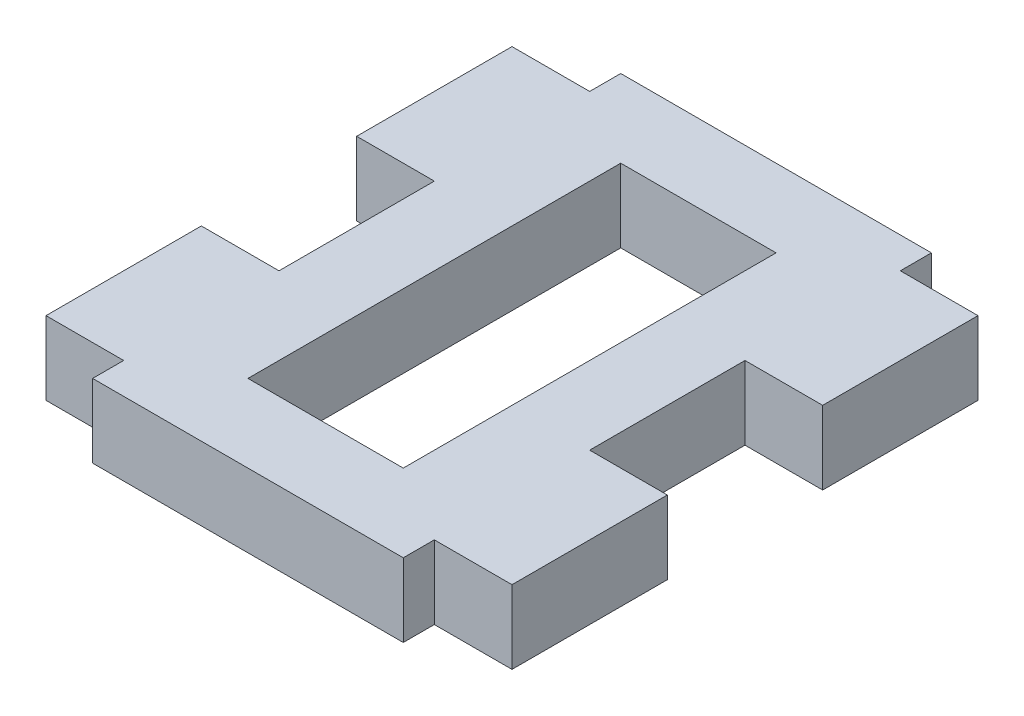
ISO-10303-21;
HEADER;
FILE_DESCRIPTION(('STEP AP214'),'2;1');
FILE_NAME('part.step','',(''),(''),'','','');
FILE_SCHEMA(('AUTOMOTIVE_DESIGN { 1 0 10303 214 1 1 1 1 }'));
ENDSEC;
DATA;
#1=APPLICATION_CONTEXT('core data for automotive mechanical design processes');
#2=APPLICATION_PROTOCOL_DEFINITION('international standard','automotive_design',2000,#1);
#3=PRODUCT_CONTEXT('',#1,'mechanical');
#4=PRODUCT('Part','Part','',(#3));
#5=PRODUCT_RELATED_PRODUCT_CATEGORY('part','',(#4));
#6=PRODUCT_DEFINITION_FORMATION('','',#4);
#7=PRODUCT_DEFINITION_CONTEXT('part definition',#1,'design');
#8=PRODUCT_DEFINITION('design','',#6,#7);
#9=PRODUCT_DEFINITION_SHAPE('','',#8);
#10=(LENGTH_UNIT() NAMED_UNIT(*) SI_UNIT(.MILLI.,.METRE.));
#11=(NAMED_UNIT(*) PLANE_ANGLE_UNIT() SI_UNIT($,.RADIAN.));
#12=(NAMED_UNIT(*) SI_UNIT($,.STERADIAN.) SOLID_ANGLE_UNIT());
#13=UNCERTAINTY_MEASURE_WITH_UNIT(LENGTH_MEASURE(1.E-05),#10,'distance_accuracy_value','');
#14=(GEOMETRIC_REPRESENTATION_CONTEXT(3) GLOBAL_UNCERTAINTY_ASSIGNED_CONTEXT((#13)) GLOBAL_UNIT_ASSIGNED_CONTEXT((#10,
#11,#12)) REPRESENTATION_CONTEXT('',''));
#15=CARTESIAN_POINT('',(0.,0.,0.));
#16=DIRECTION('',(0.,0.,1.));
#17=DIRECTION('',(1.,0.,0.));
#18=AXIS2_PLACEMENT_3D('',#15,#16,#17);
#19=CARTESIAN_POINT('',(12.7,6.,21.59));
#20=DIRECTION('',(-1.,0.,0.));
#21=DIRECTION('',(0.,0.,1.));
#22=AXIS2_PLACEMENT_3D('',#19,#20,#21);
#23=PLANE('',#22);
#24=DIRECTION('',(0.,-1.,0.));
#25=VECTOR('',#24,1.);
#26=CARTESIAN_POINT('',(12.7,20.1990316571237,-6.35000000000001));
#27=LINE('',#26,#25);
#28=CARTESIAN_POINT('',(12.7,6.,-6.35000000000001));
#29=VERTEX_POINT('',#28);
#30=CARTESIAN_POINT('',(12.7,0.,-6.35000000000001));
#31=VERTEX_POINT('',#30);
#32=EDGE_CURVE('E307',#29,#31,#27,.T.);
#33=ORIENTED_EDGE('',*,*,#32,.F.);
#34=DIRECTION('',(0.,0.,-1.));
#35=VECTOR('',#34,1.);
#36=CARTESIAN_POINT('',(12.7,6.,21.59));
#37=LINE('',#36,#35);
#38=CARTESIAN_POINT('',(12.7,6.,6.35000000000001));
#39=VERTEX_POINT('',#38);
#40=EDGE_CURVE('E399',#39,#29,#37,.T.);
#41=ORIENTED_EDGE('',*,*,#40,.F.);
#42=DIRECTION('',(0.,-1.,0.));
#43=VECTOR('',#42,1.);
#44=CARTESIAN_POINT('',(12.7,20.1990316571237,6.35000000000001));
#45=LINE('',#44,#43);
#46=CARTESIAN_POINT('',(12.7,0.,6.35000000000001));
#47=VERTEX_POINT('',#46);
#48=EDGE_CURVE('E270',#39,#47,#45,.T.);
#49=ORIENTED_EDGE('',*,*,#48,.T.);
#50=DIRECTION('',(0.,0.,-1.));
#51=VECTOR('',#50,1.);
#52=CARTESIAN_POINT('',(12.7,0.,21.59));
#53=LINE('',#52,#51);
#54=EDGE_CURVE('E417',#47,#31,#53,.T.);
#55=ORIENTED_EDGE('',*,*,#54,.T.);
#56=EDGE_LOOP('',(#33,#41,#49,#55));
#57=FACE_BOUND('',#56,.T.);
#58=ADVANCED_FACE('F43',(#57),#23,.F.);
#59=DIRECTION('',(0.,-1.,0.));
#60=VECTOR('',#59,1.);
#61=CARTESIAN_POINT('',(12.7,20.1990316571237,19.05));
#62=LINE('',#61,#60);
#63=CARTESIAN_POINT('',(12.7,6.,19.05));
#64=VERTEX_POINT('',#63);
#65=CARTESIAN_POINT('',(12.7,0.,19.05));
#66=VERTEX_POINT('',#65);
#67=EDGE_CURVE('E266',#64,#66,#62,.T.);
#68=ORIENTED_EDGE('',*,*,#67,.F.);
#69=CARTESIAN_POINT('',(12.7,6.,21.59));
#70=VERTEX_POINT('',#69);
#71=EDGE_CURVE('E394',#70,#64,#37,.T.);
#72=ORIENTED_EDGE('',*,*,#71,.F.);
#73=DIRECTION('',(0.,-1.,0.));
#74=VECTOR('',#73,1.);
#75=CARTESIAN_POINT('',(12.7,6.,21.59));
#76=LINE('',#75,#74);
#77=CARTESIAN_POINT('',(12.7,0.,21.59));
#78=VERTEX_POINT('',#77);
#79=EDGE_CURVE('E412',#70,#78,#76,.T.);
#80=ORIENTED_EDGE('',*,*,#79,.T.);
#81=EDGE_CURVE('E413',#78,#66,#53,.T.);
#82=ORIENTED_EDGE('',*,*,#81,.T.);
#83=EDGE_LOOP('',(#68,#72,#80,#82));
#84=FACE_BOUND('',#83,.T.);
#85=ADVANCED_FACE('F496',(#84),#23,.F.);
#86=CARTESIAN_POINT('',(-12.7,6.,21.59));
#87=DIRECTION('',(1.,0.,0.));
#88=DIRECTION('',(0.,0.,-1.));
#89=AXIS2_PLACEMENT_3D('',#86,#87,#88);
#90=PLANE('',#89);
#91=DIRECTION('',(0.,-1.,0.));
#92=VECTOR('',#91,1.);
#93=CARTESIAN_POINT('',(-12.7,20.1990316571237,-19.05));
#94=LINE('',#93,#92);
#95=CARTESIAN_POINT('',(-12.7,6.,-19.05));
#96=VERTEX_POINT('',#95);
#97=CARTESIAN_POINT('',(-12.7,0.,-19.05));
#98=VERTEX_POINT('',#97);
#99=EDGE_CURVE('E336',#96,#98,#94,.T.);
#100=ORIENTED_EDGE('',*,*,#99,.F.);
#101=DIRECTION('',(0.,0.,1.));
#102=VECTOR('',#101,1.);
#103=CARTESIAN_POINT('',(-12.7,6.,21.59));
#104=LINE('',#103,#102);
#105=CARTESIAN_POINT('',(-12.7,6.,-21.59));
#106=VERTEX_POINT('',#105);
#107=EDGE_CURVE('E404',#106,#96,#104,.T.);
#108=ORIENTED_EDGE('',*,*,#107,.F.);
#109=DIRECTION('',(0.,-1.,0.));
#110=VECTOR('',#109,1.);
#111=CARTESIAN_POINT('',(-12.7,6.,-21.59));
#112=LINE('',#111,#110);
#113=CARTESIAN_POINT('',(-12.7,0.,-21.59));
#114=VERTEX_POINT('',#113);
#115=EDGE_CURVE('E52',#106,#114,#112,.T.);
#116=ORIENTED_EDGE('',*,*,#115,.T.);
#117=DIRECTION('',(0.,0.,1.));
#118=VECTOR('',#117,1.);
#119=CARTESIAN_POINT('',(-12.7,0.,21.59));
#120=LINE('',#119,#118);
#121=EDGE_CURVE('E421',#114,#98,#120,.T.);
#122=ORIENTED_EDGE('',*,*,#121,.T.);
#123=EDGE_LOOP('',(#100,#108,#116,#122));
#124=FACE_BOUND('',#123,.T.);
#125=ADVANCED_FACE('F440',(#124),#90,.F.);
#126=CARTESIAN_POINT('',(-12.7,6.,-6.35));
#127=VERTEX_POINT('',#126);
#128=CARTESIAN_POINT('',(-12.7,6.,6.35));
#129=VERTEX_POINT('',#128);
#130=EDGE_CURVE('E409',#127,#129,#104,.T.);
#131=ORIENTED_EDGE('',*,*,#130,.F.);
#132=DIRECTION('',(0.,-1.,0.));
#133=VECTOR('',#132,1.);
#134=CARTESIAN_POINT('',(-12.7,20.1990316571237,-6.35));
#135=LINE('',#134,#133);
#136=CARTESIAN_POINT('',(-12.7,0.,-6.35));
#137=VERTEX_POINT('',#136);
#138=EDGE_CURVE('E340',#127,#137,#135,.T.);
#139=ORIENTED_EDGE('',*,*,#138,.T.);
#140=CARTESIAN_POINT('',(-12.7,0.,6.35));
#141=VERTEX_POINT('',#140);
#142=EDGE_CURVE('E425',#137,#141,#120,.T.);
#143=ORIENTED_EDGE('',*,*,#142,.T.);
#144=DIRECTION('',(0.,-1.,0.));
#145=VECTOR('',#144,1.);
#146=CARTESIAN_POINT('',(-12.7,20.1990316571237,6.35));
#147=LINE('',#146,#145);
#148=EDGE_CURVE('E363',#129,#141,#147,.T.);
#149=ORIENTED_EDGE('',*,*,#148,.F.);
#150=EDGE_LOOP('',(#131,#139,#143,#149));
#151=FACE_BOUND('',#150,.T.);
#152=ADVANCED_FACE('F540',(#151),#90,.F.);
#153=CARTESIAN_POINT('',(12.7,6.,-19.05));
#154=VERTEX_POINT('',#153);
#155=CARTESIAN_POINT('',(12.7,6.,-21.59));
#156=VERTEX_POINT('',#155);
#157=EDGE_CURVE('E400',#154,#156,#37,.T.);
#158=ORIENTED_EDGE('',*,*,#157,.F.);
#159=DIRECTION('',(0.,-1.,0.));
#160=VECTOR('',#159,1.);
#161=CARTESIAN_POINT('',(12.7,20.1990316571237,-19.05));
#162=LINE('',#161,#160);
#163=CARTESIAN_POINT('',(12.7,0.,-19.05));
#164=VERTEX_POINT('',#163);
#165=EDGE_CURVE('E297',#154,#164,#162,.T.);
#166=ORIENTED_EDGE('',*,*,#165,.T.);
#167=CARTESIAN_POINT('',(12.7,0.,-21.59));
#168=VERTEX_POINT('',#167);
#169=EDGE_CURVE('E393',#164,#168,#53,.T.);
#170=ORIENTED_EDGE('',*,*,#169,.T.);
#171=DIRECTION('',(0.,-1.,0.));
#172=VECTOR('',#171,1.);
#173=CARTESIAN_POINT('',(12.7,6.,-21.59));
#174=LINE('',#173,#172);
#175=EDGE_CURVE('E11',#156,#168,#174,.T.);
#176=ORIENTED_EDGE('',*,*,#175,.F.);
#177=EDGE_LOOP('',(#158,#166,#170,#176));
#178=FACE_BOUND('',#177,.T.);
#179=ADVANCED_FACE('F45',(#178),#23,.F.);
#180=CARTESIAN_POINT('',(-12.7,6.,-21.59));
#181=DIRECTION('',(0.,0.,1.));
#182=DIRECTION('',(1.,0.,0.));
#183=AXIS2_PLACEMENT_3D('',#180,#181,#182);
#184=PLANE('',#183);
#185=DIRECTION('',(-1.,0.,0.));
#186=VECTOR('',#185,1.);
#187=CARTESIAN_POINT('',(-12.7,0.,-21.59));
#188=LINE('',#187,#186);
#189=EDGE_CURVE('E416',#168,#114,#188,.T.);
#190=ORIENTED_EDGE('',*,*,#189,.T.);
#191=ORIENTED_EDGE('',*,*,#115,.F.);
#192=DIRECTION('',(-1.,0.,0.));
#193=VECTOR('',#192,1.);
#194=CARTESIAN_POINT('',(-12.7,6.,-21.59));
#195=LINE('',#194,#193);
#196=EDGE_CURVE('E398',#156,#106,#195,.T.);
#197=ORIENTED_EDGE('',*,*,#196,.F.);
#198=ORIENTED_EDGE('',*,*,#175,.T.);
#199=EDGE_LOOP('',(#190,#191,#197,#198));
#200=FACE_BOUND('',#199,.T.);
#201=ADVANCED_FACE('F456',(#200),#184,.F.);
#202=CARTESIAN_POINT('',(-12.7,6.,19.05));
#203=VERTEX_POINT('',#202);
#204=CARTESIAN_POINT('',(-12.7,6.,21.59));
#205=VERTEX_POINT('',#204);
#206=EDGE_CURVE('E403',#203,#205,#104,.T.);
#207=ORIENTED_EDGE('',*,*,#206,.F.);
#208=DIRECTION('',(0.,-1.,0.));
#209=VECTOR('',#208,1.);
#210=CARTESIAN_POINT('',(-12.7,20.1990316571237,19.05));
#211=LINE('',#210,#209);
#212=CARTESIAN_POINT('',(-12.7,0.,19.05));
#213=VERTEX_POINT('',#212);
#214=EDGE_CURVE('E378',#203,#213,#211,.T.);
#215=ORIENTED_EDGE('',*,*,#214,.T.);
#216=CARTESIAN_POINT('',(-12.7,0.,21.59));
#217=VERTEX_POINT('',#216);
#218=EDGE_CURVE('E420',#213,#217,#120,.T.);
#219=ORIENTED_EDGE('',*,*,#218,.T.);
#220=DIRECTION('',(0.,-1.,0.));
#221=VECTOR('',#220,1.);
#222=CARTESIAN_POINT('',(-12.7,6.,21.59));
#223=LINE('',#222,#221);
#224=EDGE_CURVE('E431',#205,#217,#223,.T.);
#225=ORIENTED_EDGE('',*,*,#224,.F.);
#226=EDGE_LOOP('',(#207,#215,#219,#225));
#227=FACE_BOUND('',#226,.T.);
#228=ADVANCED_FACE('F486',(#227),#90,.F.);
#229=CARTESIAN_POINT('',(-12.7,6.,21.59));
#230=DIRECTION('',(0.,0.,-1.));
#231=DIRECTION('',(-1.,0.,0.));
#232=AXIS2_PLACEMENT_3D('',#229,#230,#231);
#233=PLANE('',#232);
#234=DIRECTION('',(1.,0.,0.));
#235=VECTOR('',#234,1.);
#236=CARTESIAN_POINT('',(-12.7,0.,21.59));
#237=LINE('',#236,#235);
#238=EDGE_CURVE('E424',#217,#78,#237,.T.);
#239=ORIENTED_EDGE('',*,*,#238,.T.);
#240=ORIENTED_EDGE('',*,*,#79,.F.);
#241=DIRECTION('',(1.,0.,0.));
#242=VECTOR('',#241,1.);
#243=CARTESIAN_POINT('',(-12.7,6.,21.59));
#244=LINE('',#243,#242);
#245=EDGE_CURVE('E408',#205,#70,#244,.T.);
#246=ORIENTED_EDGE('',*,*,#245,.F.);
#247=ORIENTED_EDGE('',*,*,#224,.T.);
#248=EDGE_LOOP('',(#239,#240,#246,#247));
#249=FACE_BOUND('',#248,.T.);
#250=ADVANCED_FACE('F492',(#249),#233,.F.);
#251=CARTESIAN_POINT('',(0.,6.,0.));
#252=DIRECTION('',(0.,-1.,0.));
#253=DIRECTION('',(0.,0.,-1.));
#254=AXIS2_PLACEMENT_3D('',#251,#252,#253);
#255=PLANE('',#254);
#256=DIRECTION('',(1.,0.,0.));
#257=VECTOR('',#256,1.);
#258=CARTESIAN_POINT('',(-6.35,6.,-15.24));
#259=LINE('',#258,#257);
#260=CARTESIAN_POINT('',(-6.35,6.,-15.24));
#261=VERTEX_POINT('',#260);
#262=CARTESIAN_POINT('',(6.35,6.,-15.24));
#263=VERTEX_POINT('',#262);
#264=EDGE_CURVE('E214',#261,#263,#259,.T.);
#265=ORIENTED_EDGE('',*,*,#264,.T.);
#266=DIRECTION('',(0.,0.,1.));
#267=VECTOR('',#266,1.);
#268=CARTESIAN_POINT('',(6.35,6.,-15.24));
#269=LINE('',#268,#267);
#270=CARTESIAN_POINT('',(6.35,6.,15.24));
#271=VERTEX_POINT('',#270);
#272=EDGE_CURVE('E207',#263,#271,#269,.T.);
#273=ORIENTED_EDGE('',*,*,#272,.T.);
#274=DIRECTION('',(-1.,0.,0.));
#275=VECTOR('',#274,1.);
#276=CARTESIAN_POINT('',(-6.35,6.,15.24));
#277=LINE('',#276,#275);
#278=CARTESIAN_POINT('',(-6.35,6.,15.24));
#279=VERTEX_POINT('',#278);
#280=EDGE_CURVE('E217',#271,#279,#277,.T.);
#281=ORIENTED_EDGE('',*,*,#280,.T.);
#282=DIRECTION('',(0.,0.,-1.));
#283=VECTOR('',#282,1.);
#284=CARTESIAN_POINT('',(-6.35,6.,-15.24));
#285=LINE('',#284,#283);
#286=EDGE_CURVE('E59',#279,#261,#285,.T.);
#287=ORIENTED_EDGE('',*,*,#286,.T.);
#288=EDGE_LOOP('',(#265,#273,#281,#287));
#289=FACE_BOUND('',#288,.T.);
#290=ORIENTED_EDGE('',*,*,#71,.T.);
#291=DIRECTION('',(1.,0.,0.));
#292=VECTOR('',#291,1.);
#293=CARTESIAN_POINT('',(12.7,6.,19.05));
#294=LINE('',#293,#292);
#295=CARTESIAN_POINT('',(19.05,6.,19.05));
#296=VERTEX_POINT('',#295);
#297=EDGE_CURVE('E273',#64,#296,#294,.T.);
#298=ORIENTED_EDGE('',*,*,#297,.T.);
#299=DIRECTION('',(0.,0.,-1.));
#300=VECTOR('',#299,1.);
#301=CARTESIAN_POINT('',(19.05,6.,19.05));
#302=LINE('',#301,#300);
#303=CARTESIAN_POINT('',(19.05,6.,6.35000000000001));
#304=VERTEX_POINT('',#303);
#305=EDGE_CURVE('E254',#296,#304,#302,.T.);
#306=ORIENTED_EDGE('',*,*,#305,.T.);
#307=DIRECTION('',(-1.,0.,0.));
#308=VECTOR('',#307,1.);
#309=CARTESIAN_POINT('',(19.05,6.,6.35000000000001));
#310=LINE('',#309,#308);
#311=EDGE_CURVE('E257',#304,#39,#310,.T.);
#312=ORIENTED_EDGE('',*,*,#311,.T.);
#313=ORIENTED_EDGE('',*,*,#40,.T.);
#314=DIRECTION('',(1.,0.,0.));
#315=VECTOR('',#314,1.);
#316=CARTESIAN_POINT('',(19.05,6.,-6.35000000000001));
#317=LINE('',#316,#315);
#318=CARTESIAN_POINT('',(19.05,6.,-6.35000000000001));
#319=VERTEX_POINT('',#318);
#320=EDGE_CURVE('E295',#29,#319,#317,.T.);
#321=ORIENTED_EDGE('',*,*,#320,.T.);
#322=DIRECTION('',(0.,0.,-1.));
#323=VECTOR('',#322,1.);
#324=CARTESIAN_POINT('',(19.05,6.,-19.05));
#325=LINE('',#324,#323);
#326=CARTESIAN_POINT('',(19.05,6.,-19.05));
#327=VERTEX_POINT('',#326);
#328=EDGE_CURVE('E311',#319,#327,#325,.T.);
#329=ORIENTED_EDGE('',*,*,#328,.T.);
#330=DIRECTION('',(-1.,0.,0.));
#331=VECTOR('',#330,1.);
#332=CARTESIAN_POINT('',(12.7,6.,-19.05));
#333=LINE('',#332,#331);
#334=EDGE_CURVE('E291',#327,#154,#333,.T.);
#335=ORIENTED_EDGE('',*,*,#334,.T.);
#336=ORIENTED_EDGE('',*,*,#157,.T.);
#337=ORIENTED_EDGE('',*,*,#196,.T.);
#338=ORIENTED_EDGE('',*,*,#107,.T.);
#339=DIRECTION('',(-1.,0.,0.));
#340=VECTOR('',#339,1.);
#341=CARTESIAN_POINT('',(-12.7,6.,-19.05));
#342=LINE('',#341,#340);
#343=CARTESIAN_POINT('',(-19.05,6.,-19.05));
#344=VERTEX_POINT('',#343);
#345=EDGE_CURVE('E343',#96,#344,#342,.T.);
#346=ORIENTED_EDGE('',*,*,#345,.T.);
#347=DIRECTION('',(0.,0.,1.));
#348=VECTOR('',#347,1.);
#349=CARTESIAN_POINT('',(-19.05,6.,-19.05));
#350=LINE('',#349,#348);
#351=CARTESIAN_POINT('',(-19.05,6.,-6.35));
#352=VERTEX_POINT('',#351);
#353=EDGE_CURVE('E248',#344,#352,#350,.T.);
#354=ORIENTED_EDGE('',*,*,#353,.T.);
#355=DIRECTION('',(1.,0.,0.));
#356=VECTOR('',#355,1.);
#357=CARTESIAN_POINT('',(-19.05,6.,-6.35));
#358=LINE('',#357,#356);
#359=EDGE_CURVE('E328',#352,#127,#358,.T.);
#360=ORIENTED_EDGE('',*,*,#359,.T.);
#361=ORIENTED_EDGE('',*,*,#130,.T.);
#362=DIRECTION('',(-1.,0.,0.));
#363=VECTOR('',#362,1.);
#364=CARTESIAN_POINT('',(-19.05,6.,6.35));
#365=LINE('',#364,#363);
#366=CARTESIAN_POINT('',(-19.05,6.,6.35));
#367=VERTEX_POINT('',#366);
#368=EDGE_CURVE('E362',#129,#367,#365,.T.);
#369=ORIENTED_EDGE('',*,*,#368,.T.);
#370=DIRECTION('',(0.,0.,1.));
#371=VECTOR('',#370,1.);
#372=CARTESIAN_POINT('',(-19.05,6.,19.05));
#373=LINE('',#372,#371);
#374=CARTESIAN_POINT('',(-19.05,6.,19.05));
#375=VERTEX_POINT('',#374);
#376=EDGE_CURVE('E359',#367,#375,#373,.T.);
#377=ORIENTED_EDGE('',*,*,#376,.T.);
#378=DIRECTION('',(1.,0.,0.));
#379=VECTOR('',#378,1.);
#380=CARTESIAN_POINT('',(-12.7,6.,19.05));
#381=LINE('',#380,#379);
#382=EDGE_CURVE('E366',#375,#203,#381,.T.);
#383=ORIENTED_EDGE('',*,*,#382,.T.);
#384=ORIENTED_EDGE('',*,*,#206,.T.);
#385=ORIENTED_EDGE('',*,*,#245,.T.);
#386=EDGE_LOOP('',(#290,#298,#306,#312,#313,#321,#329,#335,#336,#337,#338,#346,#354,#360,#361,
#369,#377,#383,#384,#385));
#387=FACE_BOUND('',#386,.T.);
#388=ADVANCED_FACE('F222',(#289,#387),#255,.F.);
#389=CARTESIAN_POINT('',(0.,0.,0.));
#390=DIRECTION('',(0.,-1.,0.));
#391=DIRECTION('',(0.,0.,-1.));
#392=AXIS2_PLACEMENT_3D('',#389,#390,#391);
#393=PLANE('',#392);
#394=DIRECTION('',(0.,0.,1.));
#395=VECTOR('',#394,1.);
#396=CARTESIAN_POINT('',(6.35,0.,-15.24));
#397=LINE('',#396,#395);
#398=CARTESIAN_POINT('',(6.35,0.,-15.24));
#399=VERTEX_POINT('',#398);
#400=CARTESIAN_POINT('',(6.35,0.,15.24));
#401=VERTEX_POINT('',#400);
#402=EDGE_CURVE('E67',#399,#401,#397,.T.);
#403=ORIENTED_EDGE('',*,*,#402,.F.);
#404=DIRECTION('',(1.,0.,0.));
#405=VECTOR('',#404,1.);
#406=CARTESIAN_POINT('',(-6.35,0.,-15.24));
#407=LINE('',#406,#405);
#408=CARTESIAN_POINT('',(-6.35,0.,-15.24));
#409=VERTEX_POINT('',#408);
#410=EDGE_CURVE('E226',#409,#399,#407,.T.);
#411=ORIENTED_EDGE('',*,*,#410,.F.);
#412=DIRECTION('',(0.,0.,-1.));
#413=VECTOR('',#412,1.);
#414=CARTESIAN_POINT('',(-6.35,0.,-15.24));
#415=LINE('',#414,#413);
#416=CARTESIAN_POINT('',(-6.35,0.,15.24));
#417=VERTEX_POINT('',#416);
#418=EDGE_CURVE('E230',#417,#409,#415,.T.);
#419=ORIENTED_EDGE('',*,*,#418,.F.);
#420=DIRECTION('',(-1.,0.,0.));
#421=VECTOR('',#420,1.);
#422=CARTESIAN_POINT('',(-6.35,0.,15.24));
#423=LINE('',#422,#421);
#424=EDGE_CURVE('E239',#401,#417,#423,.T.);
#425=ORIENTED_EDGE('',*,*,#424,.F.);
#426=EDGE_LOOP('',(#403,#411,#419,#425));
#427=FACE_BOUND('',#426,.T.);
#428=ORIENTED_EDGE('',*,*,#81,.F.);
#429=ORIENTED_EDGE('',*,*,#238,.F.);
#430=ORIENTED_EDGE('',*,*,#218,.F.);
#431=DIRECTION('',(-1.,0.,0.));
#432=VECTOR('',#431,1.);
#433=CARTESIAN_POINT('',(-12.7,0.,19.05));
#434=LINE('',#433,#432);
#435=CARTESIAN_POINT('',(-19.05,0.,19.05));
#436=VERTEX_POINT('',#435);
#437=EDGE_CURVE('E285',#213,#436,#434,.T.);
#438=ORIENTED_EDGE('',*,*,#437,.T.);
#439=DIRECTION('',(0.,0.,-1.));
#440=VECTOR('',#439,1.);
#441=CARTESIAN_POINT('',(-19.05,0.,19.05));
#442=LINE('',#441,#440);
#443=CARTESIAN_POINT('',(-19.05,0.,6.35));
#444=VERTEX_POINT('',#443);
#445=EDGE_CURVE('E370',#436,#444,#442,.T.);
#446=ORIENTED_EDGE('',*,*,#445,.T.);
#447=DIRECTION('',(1.,0.,0.));
#448=VECTOR('',#447,1.);
#449=CARTESIAN_POINT('',(-19.05,0.,6.35));
#450=LINE('',#449,#448);
#451=EDGE_CURVE('E374',#444,#141,#450,.T.);
#452=ORIENTED_EDGE('',*,*,#451,.T.);
#453=ORIENTED_EDGE('',*,*,#142,.F.);
#454=DIRECTION('',(-1.,0.,0.));
#455=VECTOR('',#454,1.);
#456=CARTESIAN_POINT('',(-19.05,0.,-6.35));
#457=LINE('',#456,#455);
#458=CARTESIAN_POINT('',(-19.05,0.,-6.35));
#459=VERTEX_POINT('',#458);
#460=EDGE_CURVE('E296',#137,#459,#457,.T.);
#461=ORIENTED_EDGE('',*,*,#460,.T.);
#462=DIRECTION('',(0.,0.,-1.));
#463=VECTOR('',#462,1.);
#464=CARTESIAN_POINT('',(-19.05,0.,-19.05));
#465=LINE('',#464,#463);
#466=CARTESIAN_POINT('',(-19.05,0.,-19.05));
#467=VERTEX_POINT('',#466);
#468=EDGE_CURVE('E347',#459,#467,#465,.T.);
#469=ORIENTED_EDGE('',*,*,#468,.T.);
#470=DIRECTION('',(1.,0.,0.));
#471=VECTOR('',#470,1.);
#472=CARTESIAN_POINT('',(-12.7,0.,-19.05));
#473=LINE('',#472,#471);
#474=EDGE_CURVE('E332',#467,#98,#473,.T.);
#475=ORIENTED_EDGE('',*,*,#474,.T.);
#476=ORIENTED_EDGE('',*,*,#121,.F.);
#477=ORIENTED_EDGE('',*,*,#189,.F.);
#478=ORIENTED_EDGE('',*,*,#169,.F.);
#479=DIRECTION('',(1.,0.,0.));
#480=VECTOR('',#479,1.);
#481=CARTESIAN_POINT('',(12.7,0.,-19.05));
#482=LINE('',#481,#480);
#483=CARTESIAN_POINT('',(19.05,0.,-19.05));
#484=VERTEX_POINT('',#483);
#485=EDGE_CURVE('E258',#164,#484,#482,.T.);
#486=ORIENTED_EDGE('',*,*,#485,.T.);
#487=DIRECTION('',(0.,0.,1.));
#488=VECTOR('',#487,1.);
#489=CARTESIAN_POINT('',(19.05,0.,-19.05));
#490=LINE('',#489,#488);
#491=CARTESIAN_POINT('',(19.05,0.,-6.35000000000001));
#492=VERTEX_POINT('',#491);
#493=EDGE_CURVE('E315',#484,#492,#490,.T.);
#494=ORIENTED_EDGE('',*,*,#493,.T.);
#495=DIRECTION('',(-1.,0.,0.));
#496=VECTOR('',#495,1.);
#497=CARTESIAN_POINT('',(19.05,0.,-6.35000000000001));
#498=LINE('',#497,#496);
#499=EDGE_CURVE('E300',#492,#31,#498,.T.);
#500=ORIENTED_EDGE('',*,*,#499,.T.);
#501=ORIENTED_EDGE('',*,*,#54,.F.);
#502=DIRECTION('',(1.,0.,0.));
#503=VECTOR('',#502,1.);
#504=CARTESIAN_POINT('',(19.05,0.,6.35000000000001));
#505=LINE('',#504,#503);
#506=CARTESIAN_POINT('',(19.05,0.,6.35000000000001));
#507=VERTEX_POINT('',#506);
#508=EDGE_CURVE('E281',#47,#507,#505,.T.);
#509=ORIENTED_EDGE('',*,*,#508,.T.);
#510=DIRECTION('',(0.,0.,1.));
#511=VECTOR('',#510,1.);
#512=CARTESIAN_POINT('',(19.05,0.,19.05));
#513=LINE('',#512,#511);
#514=CARTESIAN_POINT('',(19.05,0.,19.05));
#515=VERTEX_POINT('',#514);
#516=EDGE_CURVE('E277',#507,#515,#513,.T.);
#517=ORIENTED_EDGE('',*,*,#516,.T.);
#518=DIRECTION('',(-1.,0.,0.));
#519=VECTOR('',#518,1.);
#520=CARTESIAN_POINT('',(12.7,0.,19.05));
#521=LINE('',#520,#519);
#522=EDGE_CURVE('E262',#515,#66,#521,.T.);
#523=ORIENTED_EDGE('',*,*,#522,.T.);
#524=EDGE_LOOP('',(#428,#429,#430,#438,#446,#452,#453,#461,#469,#475,#476,#477,#478,#486,#494,
#500,#501,#509,#517,#523));
#525=FACE_BOUND('',#524,.T.);
#526=ADVANCED_FACE('F446',(#427,#525),#393,.T.);
#527=CARTESIAN_POINT('',(-19.05,20.1990316571237,6.35));
#528=DIRECTION('',(0.,0.,-1.));
#529=DIRECTION('',(-1.,0.,0.));
#530=AXIS2_PLACEMENT_3D('',#527,#528,#529);
#531=PLANE('',#530);
#532=ORIENTED_EDGE('',*,*,#368,.F.);
#533=ORIENTED_EDGE('',*,*,#148,.T.);
#534=ORIENTED_EDGE('',*,*,#451,.F.);
#535=DIRECTION('',(0.,-1.,0.));
#536=VECTOR('',#535,1.);
#537=CARTESIAN_POINT('',(-19.05,20.1990316571237,6.35));
#538=LINE('',#537,#536);
#539=EDGE_CURVE('E382',#367,#444,#538,.T.);
#540=ORIENTED_EDGE('',*,*,#539,.F.);
#541=EDGE_LOOP('',(#532,#533,#534,#540));
#542=FACE_BOUND('',#541,.T.);
#543=ADVANCED_FACE('F514',(#542),#531,.T.);
#544=CARTESIAN_POINT('',(-19.05,20.1990316571237,19.05));
#545=DIRECTION('',(-1.,0.,0.));
#546=DIRECTION('',(0.,0.,1.));
#547=AXIS2_PLACEMENT_3D('',#544,#545,#546);
#548=PLANE('',#547);
#549=ORIENTED_EDGE('',*,*,#376,.F.);
#550=ORIENTED_EDGE('',*,*,#539,.T.);
#551=ORIENTED_EDGE('',*,*,#445,.F.);
#552=DIRECTION('',(0.,-1.,0.));
#553=VECTOR('',#552,1.);
#554=CARTESIAN_POINT('',(-19.05,20.1990316571237,19.05));
#555=LINE('',#554,#553);
#556=EDGE_CURVE('E385',#375,#436,#555,.T.);
#557=ORIENTED_EDGE('',*,*,#556,.F.);
#558=EDGE_LOOP('',(#549,#550,#551,#557));
#559=FACE_BOUND('',#558,.T.);
#560=ADVANCED_FACE('F518',(#559),#548,.T.);
#561=CARTESIAN_POINT('',(-12.7,20.1990316571237,19.05));
#562=DIRECTION('',(0.,0.,1.));
#563=DIRECTION('',(1.,0.,0.));
#564=AXIS2_PLACEMENT_3D('',#561,#562,#563);
#565=PLANE('',#564);
#566=ORIENTED_EDGE('',*,*,#382,.F.);
#567=ORIENTED_EDGE('',*,*,#556,.T.);
#568=ORIENTED_EDGE('',*,*,#437,.F.);
#569=ORIENTED_EDGE('',*,*,#214,.F.);
#570=EDGE_LOOP('',(#566,#567,#568,#569));
#571=FACE_BOUND('',#570,.T.);
#572=ADVANCED_FACE('F522',(#571),#565,.T.);
#573=CARTESIAN_POINT('',(-19.05,20.1990316571237,-6.35));
#574=DIRECTION('',(0.,0.,1.));
#575=DIRECTION('',(1.,0.,0.));
#576=AXIS2_PLACEMENT_3D('',#573,#574,#575);
#577=PLANE('',#576);
#578=ORIENTED_EDGE('',*,*,#359,.F.);
#579=DIRECTION('',(0.,-1.,0.));
#580=VECTOR('',#579,1.);
#581=CARTESIAN_POINT('',(-19.05,20.1990316571237,-6.35));
#582=LINE('',#581,#580);
#583=EDGE_CURVE('E329',#352,#459,#582,.T.);
#584=ORIENTED_EDGE('',*,*,#583,.T.);
#585=ORIENTED_EDGE('',*,*,#460,.F.);
#586=ORIENTED_EDGE('',*,*,#138,.F.);
#587=EDGE_LOOP('',(#578,#584,#585,#586));
#588=FACE_BOUND('',#587,.T.);
#589=ADVANCED_FACE('F524',(#588),#577,.T.);
#590=CARTESIAN_POINT('',(-12.7,20.1990316571237,-19.05));
#591=DIRECTION('',(0.,0.,-1.));
#592=DIRECTION('',(-1.,0.,0.));
#593=AXIS2_PLACEMENT_3D('',#590,#591,#592);
#594=PLANE('',#593);
#595=ORIENTED_EDGE('',*,*,#345,.F.);
#596=ORIENTED_EDGE('',*,*,#99,.T.);
#597=ORIENTED_EDGE('',*,*,#474,.F.);
#598=DIRECTION('',(0.,-1.,0.));
#599=VECTOR('',#598,1.);
#600=CARTESIAN_POINT('',(-19.05,20.1990316571237,-19.05));
#601=LINE('',#600,#599);
#602=EDGE_CURVE('E333',#344,#467,#601,.T.);
#603=ORIENTED_EDGE('',*,*,#602,.F.);
#604=EDGE_LOOP('',(#595,#596,#597,#603));
#605=FACE_BOUND('',#604,.T.);
#606=ADVANCED_FACE('F453',(#605),#594,.T.);
#607=CARTESIAN_POINT('',(-19.05,20.1990316571237,-19.05));
#608=DIRECTION('',(-1.,0.,0.));
#609=DIRECTION('',(0.,0.,1.));
#610=AXIS2_PLACEMENT_3D('',#607,#608,#609);
#611=PLANE('',#610);
#612=ORIENTED_EDGE('',*,*,#353,.F.);
#613=ORIENTED_EDGE('',*,*,#602,.T.);
#614=ORIENTED_EDGE('',*,*,#468,.F.);
#615=ORIENTED_EDGE('',*,*,#583,.F.);
#616=EDGE_LOOP('',(#612,#613,#614,#615));
#617=FACE_BOUND('',#616,.T.);
#618=ADVANCED_FACE('F583',(#617),#611,.T.);
#619=CARTESIAN_POINT('',(19.05,20.1990316571237,6.35000000000001));
#620=DIRECTION('',(0.,0.,-1.));
#621=DIRECTION('',(-1.,0.,0.));
#622=AXIS2_PLACEMENT_3D('',#619,#620,#621);
#623=PLANE('',#622);
#624=ORIENTED_EDGE('',*,*,#311,.F.);
#625=DIRECTION('',(0.,-1.,0.));
#626=VECTOR('',#625,1.);
#627=CARTESIAN_POINT('',(19.05,20.1990316571237,6.35000000000001));
#628=LINE('',#627,#626);
#629=EDGE_CURVE('E259',#304,#507,#628,.T.);
#630=ORIENTED_EDGE('',*,*,#629,.T.);
#631=ORIENTED_EDGE('',*,*,#508,.F.);
#632=ORIENTED_EDGE('',*,*,#48,.F.);
#633=EDGE_LOOP('',(#624,#630,#631,#632));
#634=FACE_BOUND('',#633,.T.);
#635=ADVANCED_FACE('F580',(#634),#623,.T.);
#636=CARTESIAN_POINT('',(12.7,20.1990316571237,19.05));
#637=DIRECTION('',(0.,0.,1.));
#638=DIRECTION('',(1.,0.,0.));
#639=AXIS2_PLACEMENT_3D('',#636,#637,#638);
#640=PLANE('',#639);
#641=ORIENTED_EDGE('',*,*,#297,.F.);
#642=ORIENTED_EDGE('',*,*,#67,.T.);
#643=ORIENTED_EDGE('',*,*,#522,.F.);
#644=DIRECTION('',(0.,-1.,0.));
#645=VECTOR('',#644,1.);
#646=CARTESIAN_POINT('',(19.05,20.1990316571237,19.05));
#647=LINE('',#646,#645);
#648=EDGE_CURVE('E263',#296,#515,#647,.T.);
#649=ORIENTED_EDGE('',*,*,#648,.F.);
#650=EDGE_LOOP('',(#641,#642,#643,#649));
#651=FACE_BOUND('',#650,.T.);
#652=ADVANCED_FACE('F500',(#651),#640,.T.);
#653=CARTESIAN_POINT('',(19.05,20.1990316571237,19.05));
#654=DIRECTION('',(1.,0.,0.));
#655=DIRECTION('',(0.,0.,-1.));
#656=AXIS2_PLACEMENT_3D('',#653,#654,#655);
#657=PLANE('',#656);
#658=ORIENTED_EDGE('',*,*,#305,.F.);
#659=ORIENTED_EDGE('',*,*,#648,.T.);
#660=ORIENTED_EDGE('',*,*,#516,.F.);
#661=ORIENTED_EDGE('',*,*,#629,.F.);
#662=EDGE_LOOP('',(#658,#659,#660,#661));
#663=FACE_BOUND('',#662,.T.);
#664=ADVANCED_FACE('F585',(#663),#657,.T.);
#665=CARTESIAN_POINT('',(19.05,20.1990316571237,-6.35000000000001));
#666=DIRECTION('',(0.,0.,1.));
#667=DIRECTION('',(1.,0.,0.));
#668=AXIS2_PLACEMENT_3D('',#665,#666,#667);
#669=PLANE('',#668);
#670=ORIENTED_EDGE('',*,*,#320,.F.);
#671=ORIENTED_EDGE('',*,*,#32,.T.);
#672=ORIENTED_EDGE('',*,*,#499,.F.);
#673=DIRECTION('',(0.,-1.,0.));
#674=VECTOR('',#673,1.);
#675=CARTESIAN_POINT('',(19.05,20.1990316571237,-6.35000000000001));
#676=LINE('',#675,#674);
#677=EDGE_CURVE('E304',#319,#492,#676,.T.);
#678=ORIENTED_EDGE('',*,*,#677,.F.);
#679=EDGE_LOOP('',(#670,#671,#672,#678));
#680=FACE_BOUND('',#679,.T.);
#681=ADVANCED_FACE('F470',(#680),#669,.T.);
#682=CARTESIAN_POINT('',(19.05,20.1990316571237,-19.05));
#683=DIRECTION('',(1.,0.,0.));
#684=DIRECTION('',(0.,0.,-1.));
#685=AXIS2_PLACEMENT_3D('',#682,#683,#684);
#686=PLANE('',#685);
#687=ORIENTED_EDGE('',*,*,#328,.F.);
#688=ORIENTED_EDGE('',*,*,#677,.T.);
#689=ORIENTED_EDGE('',*,*,#493,.F.);
#690=DIRECTION('',(0.,-1.,0.));
#691=VECTOR('',#690,1.);
#692=CARTESIAN_POINT('',(19.05,20.1990316571237,-19.05));
#693=LINE('',#692,#691);
#694=EDGE_CURVE('E301',#327,#484,#693,.T.);
#695=ORIENTED_EDGE('',*,*,#694,.F.);
#696=EDGE_LOOP('',(#687,#688,#689,#695));
#697=FACE_BOUND('',#696,.T.);
#698=ADVANCED_FACE('F476',(#697),#686,.T.);
#699=CARTESIAN_POINT('',(12.7,20.1990316571237,-19.05));
#700=DIRECTION('',(0.,0.,-1.));
#701=DIRECTION('',(-1.,0.,0.));
#702=AXIS2_PLACEMENT_3D('',#699,#700,#701);
#703=PLANE('',#702);
#704=ORIENTED_EDGE('',*,*,#334,.F.);
#705=ORIENTED_EDGE('',*,*,#694,.T.);
#706=ORIENTED_EDGE('',*,*,#485,.F.);
#707=ORIENTED_EDGE('',*,*,#165,.F.);
#708=EDGE_LOOP('',(#704,#705,#706,#707));
#709=FACE_BOUND('',#708,.T.);
#710=ADVANCED_FACE('F575',(#709),#703,.T.);
#711=CARTESIAN_POINT('',(6.35,6.,-15.24));
#712=DIRECTION('',(1.,0.,0.));
#713=DIRECTION('',(0.,0.,-1.));
#714=AXIS2_PLACEMENT_3D('',#711,#712,#713);
#715=PLANE('',#714);
#716=ORIENTED_EDGE('',*,*,#402,.T.);
#717=DIRECTION('',(0.,-1.,0.));
#718=VECTOR('',#717,1.);
#719=CARTESIAN_POINT('',(6.35,6.,15.24));
#720=LINE('',#719,#718);
#721=EDGE_CURVE('E203',#271,#401,#720,.T.);
#722=ORIENTED_EDGE('',*,*,#721,.F.);
#723=ORIENTED_EDGE('',*,*,#272,.F.);
#724=DIRECTION('',(0.,-1.,0.));
#725=VECTOR('',#724,1.);
#726=CARTESIAN_POINT('',(6.35,6.,-15.24));
#727=LINE('',#726,#725);
#728=EDGE_CURVE('E245',#263,#399,#727,.T.);
#729=ORIENTED_EDGE('',*,*,#728,.T.);
#730=EDGE_LOOP('',(#716,#722,#723,#729));
#731=FACE_BOUND('',#730,.T.);
#732=ADVANCED_FACE('F205',(#731),#715,.F.);
#733=CARTESIAN_POINT('',(-6.35,6.,-15.24));
#734=DIRECTION('',(0.,0.,-1.));
#735=DIRECTION('',(-1.,0.,0.));
#736=AXIS2_PLACEMENT_3D('',#733,#734,#735);
#737=PLANE('',#736);
#738=ORIENTED_EDGE('',*,*,#410,.T.);
#739=ORIENTED_EDGE('',*,*,#728,.F.);
#740=ORIENTED_EDGE('',*,*,#264,.F.);
#741=DIRECTION('',(0.,-1.,0.));
#742=VECTOR('',#741,1.);
#743=CARTESIAN_POINT('',(-6.35,6.,-15.24));
#744=LINE('',#743,#742);
#745=EDGE_CURVE('E249',#261,#409,#744,.T.);
#746=ORIENTED_EDGE('',*,*,#745,.T.);
#747=EDGE_LOOP('',(#738,#739,#740,#746));
#748=FACE_BOUND('',#747,.T.);
#749=ADVANCED_FACE('F568',(#748),#737,.F.);
#750=CARTESIAN_POINT('',(-6.35,6.,-15.24));
#751=DIRECTION('',(-1.,0.,0.));
#752=DIRECTION('',(0.,0.,1.));
#753=AXIS2_PLACEMENT_3D('',#750,#751,#752);
#754=PLANE('',#753);
#755=ORIENTED_EDGE('',*,*,#418,.T.);
#756=ORIENTED_EDGE('',*,*,#745,.F.);
#757=ORIENTED_EDGE('',*,*,#286,.F.);
#758=DIRECTION('',(0.,-1.,0.));
#759=VECTOR('',#758,1.);
#760=CARTESIAN_POINT('',(-6.35,6.,15.24));
#761=LINE('',#760,#759);
#762=EDGE_CURVE('E213',#279,#417,#761,.T.);
#763=ORIENTED_EDGE('',*,*,#762,.T.);
#764=EDGE_LOOP('',(#755,#756,#757,#763));
#765=FACE_BOUND('',#764,.T.);
#766=ADVANCED_FACE('F566',(#765),#754,.F.);
#767=CARTESIAN_POINT('',(-6.35,6.,15.24));
#768=DIRECTION('',(0.,0.,1.));
#769=DIRECTION('',(1.,0.,0.));
#770=AXIS2_PLACEMENT_3D('',#767,#768,#769);
#771=PLANE('',#770);
#772=ORIENTED_EDGE('',*,*,#424,.T.);
#773=ORIENTED_EDGE('',*,*,#762,.F.);
#774=ORIENTED_EDGE('',*,*,#280,.F.);
#775=ORIENTED_EDGE('',*,*,#721,.T.);
#776=EDGE_LOOP('',(#772,#773,#774,#775));
#777=FACE_BOUND('',#776,.T.);
#778=ADVANCED_FACE('F218',(#777),#771,.F.);
#779=CLOSED_SHELL('',(#58,#85,#125,#152,#179,#201,#228,#250,#388,#526,#543,#560,#572,#589,#606,
#618,#635,#652,#664,#681,#698,#710,#732,#749,#766,#778));
#780=MANIFOLD_SOLID_BREP('B2',#779);
#781=ADVANCED_BREP_SHAPE_REPRESENTATION('',(#18,#780),#14);
#782=SHAPE_DEFINITION_REPRESENTATION(#9,#781);
ENDSEC;
END-ISO-10303-21;
